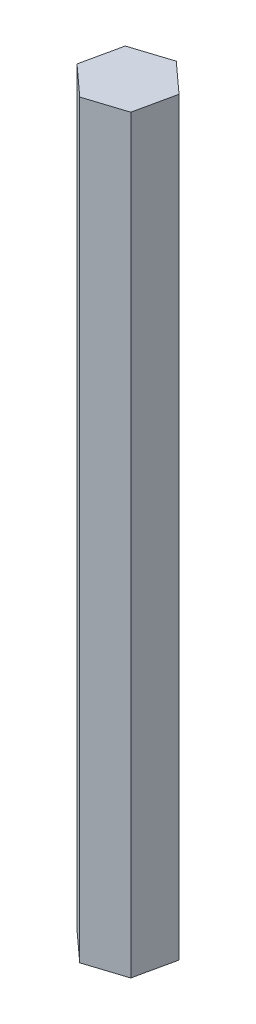
ISO-10303-21;
HEADER;
FILE_DESCRIPTION(('STEP AP214'),'2;1');
FILE_NAME('part.step','',(''),(''),'','','');
FILE_SCHEMA(('AUTOMOTIVE_DESIGN { 1 0 10303 214 1 1 1 1 }'));
ENDSEC;
DATA;
#1=APPLICATION_CONTEXT('core data for automotive mechanical design processes');
#2=APPLICATION_PROTOCOL_DEFINITION('international standard','automotive_design',2000,#1);
#3=PRODUCT_CONTEXT('',#1,'mechanical');
#4=PRODUCT('Part','Part','',(#3));
#5=PRODUCT_RELATED_PRODUCT_CATEGORY('part','',(#4));
#6=PRODUCT_DEFINITION_FORMATION('','',#4);
#7=PRODUCT_DEFINITION_CONTEXT('part definition',#1,'design');
#8=PRODUCT_DEFINITION('design','',#6,#7);
#9=PRODUCT_DEFINITION_SHAPE('','',#8);
#10=(LENGTH_UNIT() NAMED_UNIT(*) SI_UNIT(.MILLI.,.METRE.));
#11=(NAMED_UNIT(*) PLANE_ANGLE_UNIT() SI_UNIT($,.RADIAN.));
#12=(NAMED_UNIT(*) SI_UNIT($,.STERADIAN.) SOLID_ANGLE_UNIT());
#13=UNCERTAINTY_MEASURE_WITH_UNIT(LENGTH_MEASURE(1.E-05),#10,'distance_accuracy_value','');
#14=(GEOMETRIC_REPRESENTATION_CONTEXT(3) GLOBAL_UNCERTAINTY_ASSIGNED_CONTEXT((#13)) GLOBAL_UNIT_ASSIGNED_CONTEXT((#10,
#11,#12)) REPRESENTATION_CONTEXT('',''));
#15=CARTESIAN_POINT('',(0.,0.,0.));
#16=DIRECTION('',(0.,0.,1.));
#17=DIRECTION('',(1.,0.,0.));
#18=AXIS2_PLACEMENT_3D('',#15,#16,#17);
#19=CARTESIAN_POINT('',(-0.61182187926995,53.34,2.82117126764399));
#20=DIRECTION('',(-0.305094633460301,0.,-0.952322038300976));
#21=DIRECTION('',(-0.952322038300976,0.,0.305094633460301));
#22=AXIS2_PLACEMENT_3D('',#19,#20,#21);
#23=PLANE('',#22);
#24=DIRECTION('',(0.952322038300976,0.,-0.305094633460301));
#25=VECTOR('',#24,1.);
#26=CARTESIAN_POINT('',(-0.61182187926995,0.,2.82117126764399));
#27=LINE('',#26,#25);
#28=CARTESIAN_POINT('',(-0.61182187926995,0.,2.82117126764399));
#29=VERTEX_POINT('',#28);
#30=CARTESIAN_POINT('',(2.13729504657146,0.,1.94043892386091));
#31=VERTEX_POINT('',#30);
#32=EDGE_CURVE('E117',#29,#31,#27,.T.);
#33=ORIENTED_EDGE('',*,*,#32,.T.);
#34=DIRECTION('',(0.,-1.,0.));
#35=VECTOR('',#34,1.);
#36=CARTESIAN_POINT('',(2.13729504657146,53.34,1.94043892386091));
#37=LINE('',#36,#35);
#38=CARTESIAN_POINT('',(2.13729504657146,53.34,1.94043892386091));
#39=VERTEX_POINT('',#38);
#40=EDGE_CURVE('E11',#39,#31,#37,.T.);
#41=ORIENTED_EDGE('',*,*,#40,.F.);
#42=DIRECTION('',(0.952322038300976,0.,-0.305094633460301));
#43=VECTOR('',#42,1.);
#44=CARTESIAN_POINT('',(-0.61182187926995,53.34,2.82117126764399));
#45=LINE('',#44,#43);
#46=CARTESIAN_POINT('',(-0.61182187926995,53.34,2.82117126764399));
#47=VERTEX_POINT('',#46);
#48=EDGE_CURVE('E127',#47,#39,#45,.T.);
#49=ORIENTED_EDGE('',*,*,#48,.F.);
#50=DIRECTION('',(0.,-1.,0.));
#51=VECTOR('',#50,1.);
#52=CARTESIAN_POINT('',(-0.61182187926995,53.34,2.82117126764399));
#53=LINE('',#52,#51);
#54=EDGE_CURVE('E113',#47,#29,#53,.T.);
#55=ORIENTED_EDGE('',*,*,#54,.T.);
#56=EDGE_LOOP('',(#33,#41,#49,#55));
#57=FACE_BOUND('',#56,.T.);
#58=ADVANCED_FACE('F33',(#57),#23,.F.);
#59=CARTESIAN_POINT('',(2.13729504657146,53.34,1.94043892386091));
#60=DIRECTION('',(-0.977282394482572,0.,-0.211941316015566));
#61=DIRECTION('',(-0.211941316015566,0.,0.977282394482572));
#62=AXIS2_PLACEMENT_3D('',#59,#60,#61);
#63=PLANE('',#62);
#64=DIRECTION('',(0.211941316015566,0.,-0.977282394482572));
#65=VECTOR('',#64,1.);
#66=CARTESIAN_POINT('',(2.13729504657146,0.,1.94043892386091));
#67=LINE('',#66,#65);
#68=CARTESIAN_POINT('',(2.74911692584142,0.,-0.880732343783076));
#69=VERTEX_POINT('',#68);
#70=EDGE_CURVE('E120',#31,#69,#67,.T.);
#71=ORIENTED_EDGE('',*,*,#70,.T.);
#72=DIRECTION('',(0.,-1.,0.));
#73=VECTOR('',#72,1.);
#74=CARTESIAN_POINT('',(2.74911692584142,53.34,-0.880732343783076));
#75=LINE('',#74,#73);
#76=CARTESIAN_POINT('',(2.74911692584142,53.34,-0.880732343783076));
#77=VERTEX_POINT('',#76);
#78=EDGE_CURVE('E41',#77,#69,#75,.T.);
#79=ORIENTED_EDGE('',*,*,#78,.F.);
#80=DIRECTION('',(0.211941316015566,0.,-0.977282394482572));
#81=VECTOR('',#80,1.);
#82=CARTESIAN_POINT('',(2.13729504657146,53.34,1.94043892386091));
#83=LINE('',#82,#81);
#84=EDGE_CURVE('E86',#39,#77,#83,.T.);
#85=ORIENTED_EDGE('',*,*,#84,.F.);
#86=ORIENTED_EDGE('',*,*,#40,.T.);
#87=EDGE_LOOP('',(#71,#79,#85,#86));
#88=FACE_BOUND('',#87,.T.);
#89=ADVANCED_FACE('F151',(#88),#63,.F.);
#90=CARTESIAN_POINT('',(2.74911692584142,53.34,-0.880732343783076));
#91=DIRECTION('',(-0.672187761022271,0.,0.74038072228541));
#92=DIRECTION('',(0.74038072228541,0.,0.672187761022271));
#93=AXIS2_PLACEMENT_3D('',#90,#91,#92);
#94=PLANE('',#93);
#95=DIRECTION('',(-0.74038072228541,0.,-0.672187761022271));
#96=VECTOR('',#95,1.);
#97=CARTESIAN_POINT('',(2.74911692584142,0.,-0.880732343783076));
#98=LINE('',#97,#96);
#99=CARTESIAN_POINT('',(0.611821879269952,0.,-2.82117126764399));
#100=VERTEX_POINT('',#99);
#101=EDGE_CURVE('E122',#69,#100,#98,.T.);
#102=ORIENTED_EDGE('',*,*,#101,.T.);
#103=DIRECTION('',(0.,-1.,0.));
#104=VECTOR('',#103,1.);
#105=CARTESIAN_POINT('',(0.611821879269952,53.34,-2.82117126764399));
#106=LINE('',#105,#104);
#107=CARTESIAN_POINT('',(0.611821879269952,53.34,-2.82117126764399));
#108=VERTEX_POINT('',#107);
#109=EDGE_CURVE('E108',#108,#100,#106,.T.);
#110=ORIENTED_EDGE('',*,*,#109,.F.);
#111=DIRECTION('',(-0.74038072228541,0.,-0.672187761022271));
#112=VECTOR('',#111,1.);
#113=CARTESIAN_POINT('',(2.74911692584142,53.34,-0.880732343783076));
#114=LINE('',#113,#112);
#115=EDGE_CURVE('E99',#77,#108,#114,.T.);
#116=ORIENTED_EDGE('',*,*,#115,.F.);
#117=ORIENTED_EDGE('',*,*,#78,.T.);
#118=EDGE_LOOP('',(#102,#110,#116,#117));
#119=FACE_BOUND('',#118,.T.);
#120=ADVANCED_FACE('F133',(#119),#94,.F.);
#121=CARTESIAN_POINT('',(0.611821879269952,53.34,-2.82117126764399));
#122=DIRECTION('',(0.305094633460301,0.,0.952322038300976));
#123=DIRECTION('',(0.952322038300976,0.,-0.305094633460301));
#124=AXIS2_PLACEMENT_3D('',#121,#122,#123);
#125=PLANE('',#124);
#126=DIRECTION('',(-0.952322038300976,0.,0.305094633460301));
#127=VECTOR('',#126,1.);
#128=CARTESIAN_POINT('',(0.611821879269952,0.,-2.82117126764399));
#129=LINE('',#128,#127);
#130=CARTESIAN_POINT('',(-2.13729504657146,0.,-1.94043892386091));
#131=VERTEX_POINT('',#130);
#132=EDGE_CURVE('E107',#100,#131,#129,.T.);
#133=ORIENTED_EDGE('',*,*,#132,.T.);
#134=DIRECTION('',(0.,-1.,0.));
#135=VECTOR('',#134,1.);
#136=CARTESIAN_POINT('',(-2.13729504657146,53.34,-1.94043892386091));
#137=LINE('',#136,#135);
#138=CARTESIAN_POINT('',(-2.13729504657146,53.34,-1.94043892386091));
#139=VERTEX_POINT('',#138);
#140=EDGE_CURVE('E104',#139,#131,#137,.T.);
#141=ORIENTED_EDGE('',*,*,#140,.F.);
#142=DIRECTION('',(-0.952322038300976,0.,0.305094633460301));
#143=VECTOR('',#142,1.);
#144=CARTESIAN_POINT('',(0.611821879269952,53.34,-2.82117126764399));
#145=LINE('',#144,#143);
#146=EDGE_CURVE('E93',#108,#139,#145,.T.);
#147=ORIENTED_EDGE('',*,*,#146,.F.);
#148=ORIENTED_EDGE('',*,*,#109,.T.);
#149=EDGE_LOOP('',(#133,#141,#147,#148));
#150=FACE_BOUND('',#149,.T.);
#151=ADVANCED_FACE('F105',(#150),#125,.F.);
#152=CARTESIAN_POINT('',(-2.13729504657146,53.34,-1.94043892386091));
#153=DIRECTION('',(0.977282394482572,0.,0.211941316015565));
#154=DIRECTION('',(0.211941316015565,0.,-0.977282394482572));
#155=AXIS2_PLACEMENT_3D('',#152,#153,#154);
#156=PLANE('',#155);
#157=DIRECTION('',(-0.211941316015565,0.,0.977282394482572));
#158=VECTOR('',#157,1.);
#159=CARTESIAN_POINT('',(-2.13729504657146,0.,-1.94043892386091));
#160=LINE('',#159,#158);
#161=CARTESIAN_POINT('',(-2.74911692584141,0.,0.88073234378308));
#162=VERTEX_POINT('',#161);
#163=EDGE_CURVE('E72',#131,#162,#160,.T.);
#164=ORIENTED_EDGE('',*,*,#163,.T.);
#165=DIRECTION('',(0.,-1.,0.));
#166=VECTOR('',#165,1.);
#167=CARTESIAN_POINT('',(-2.74911692584141,53.34,0.88073234378308));
#168=LINE('',#167,#166);
#169=CARTESIAN_POINT('',(-2.74911692584141,53.34,0.88073234378308));
#170=VERTEX_POINT('',#169);
#171=EDGE_CURVE('E109',#170,#162,#168,.T.);
#172=ORIENTED_EDGE('',*,*,#171,.F.);
#173=DIRECTION('',(-0.211941316015565,0.,0.977282394482572));
#174=VECTOR('',#173,1.);
#175=CARTESIAN_POINT('',(-2.13729504657146,53.34,-1.94043892386091));
#176=LINE('',#175,#174);
#177=EDGE_CURVE('E97',#139,#170,#176,.T.);
#178=ORIENTED_EDGE('',*,*,#177,.F.);
#179=ORIENTED_EDGE('',*,*,#140,.T.);
#180=EDGE_LOOP('',(#164,#172,#178,#179));
#181=FACE_BOUND('',#180,.T.);
#182=ADVANCED_FACE('F111',(#181),#156,.F.);
#183=CARTESIAN_POINT('',(-2.74911692584141,53.34,0.88073234378308));
#184=DIRECTION('',(0.672187761022271,0.,-0.740380722285411));
#185=DIRECTION('',(-0.740380722285411,0.,-0.672187761022271));
#186=AXIS2_PLACEMENT_3D('',#183,#184,#185);
#187=PLANE('',#186);
#188=DIRECTION('',(0.740380722285411,0.,0.672187761022271));
#189=VECTOR('',#188,1.);
#190=CARTESIAN_POINT('',(-2.74911692584141,0.,0.88073234378308));
#191=LINE('',#190,#189);
#192=EDGE_CURVE('E78',#162,#29,#191,.T.);
#193=ORIENTED_EDGE('',*,*,#192,.T.);
#194=ORIENTED_EDGE('',*,*,#54,.F.);
#195=DIRECTION('',(0.740380722285411,0.,0.672187761022271));
#196=VECTOR('',#195,1.);
#197=CARTESIAN_POINT('',(-2.74911692584141,53.34,0.88073234378308));
#198=LINE('',#197,#196);
#199=EDGE_CURVE('E49',#170,#47,#198,.T.);
#200=ORIENTED_EDGE('',*,*,#199,.F.);
#201=ORIENTED_EDGE('',*,*,#171,.T.);
#202=EDGE_LOOP('',(#193,#194,#200,#201));
#203=FACE_BOUND('',#202,.T.);
#204=ADVANCED_FACE('F140',(#203),#187,.F.);
#205=CARTESIAN_POINT('',(0.,53.34,0.));
#206=DIRECTION('',(0.,1.,0.));
#207=DIRECTION('',(0.,0.,1.));
#208=AXIS2_PLACEMENT_3D('',#205,#206,#207);
#209=PLANE('',#208);
#210=ORIENTED_EDGE('',*,*,#48,.T.);
#211=ORIENTED_EDGE('',*,*,#84,.T.);
#212=ORIENTED_EDGE('',*,*,#115,.T.);
#213=ORIENTED_EDGE('',*,*,#146,.T.);
#214=ORIENTED_EDGE('',*,*,#177,.T.);
#215=ORIENTED_EDGE('',*,*,#199,.T.);
#216=EDGE_LOOP('',(#210,#211,#212,#213,#214,#215));
#217=FACE_BOUND('',#216,.T.);
#218=ADVANCED_FACE('F95',(#217),#209,.T.);
#219=CARTESIAN_POINT('',(0.,0.,0.));
#220=DIRECTION('',(0.,1.,0.));
#221=DIRECTION('',(0.,0.,1.));
#222=AXIS2_PLACEMENT_3D('',#219,#220,#221);
#223=PLANE('',#222);
#224=ORIENTED_EDGE('',*,*,#32,.F.);
#225=ORIENTED_EDGE('',*,*,#192,.F.);
#226=ORIENTED_EDGE('',*,*,#163,.F.);
#227=ORIENTED_EDGE('',*,*,#132,.F.);
#228=ORIENTED_EDGE('',*,*,#101,.F.);
#229=ORIENTED_EDGE('',*,*,#70,.F.);
#230=EDGE_LOOP('',(#224,#225,#226,#227,#228,#229));
#231=FACE_BOUND('',#230,.T.);
#232=ADVANCED_FACE('F136',(#231),#223,.F.);
#233=CLOSED_SHELL('',(#58,#89,#120,#151,#182,#204,#218,#232));
#234=MANIFOLD_SOLID_BREP('B2',#233);
#235=ADVANCED_BREP_SHAPE_REPRESENTATION('',(#18,#234),#14);
#236=SHAPE_DEFINITION_REPRESENTATION(#9,#235);
ENDSEC;
END-ISO-10303-21;
